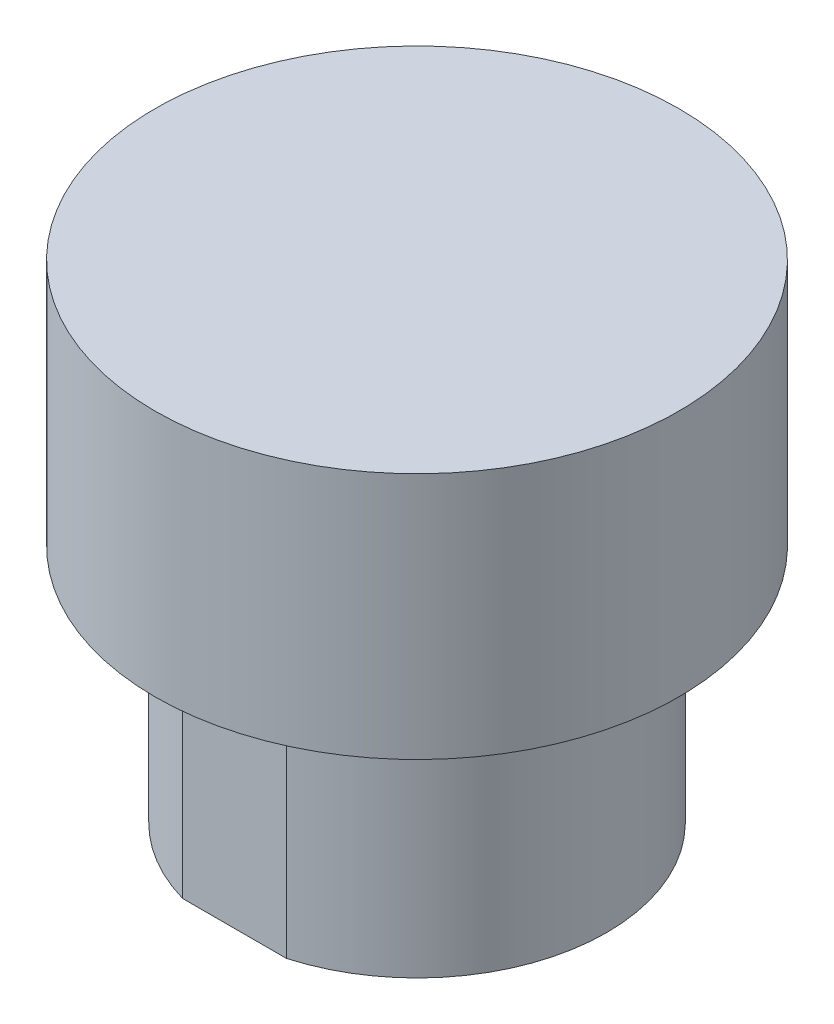
ISO-10303-21;
HEADER;
FILE_DESCRIPTION(('STEP AP214'),'2;1');
FILE_NAME('part.step','',(''),(''),'','','');
FILE_SCHEMA(('AUTOMOTIVE_DESIGN { 1 0 10303 214 1 1 1 1 }'));
ENDSEC;
DATA;
#1=APPLICATION_CONTEXT('core data for automotive mechanical design processes');
#2=APPLICATION_PROTOCOL_DEFINITION('international standard','automotive_design',2000,#1);
#3=PRODUCT_CONTEXT('',#1,'mechanical');
#4=PRODUCT('Part','Part','',(#3));
#5=PRODUCT_RELATED_PRODUCT_CATEGORY('part','',(#4));
#6=PRODUCT_DEFINITION_FORMATION('','',#4);
#7=PRODUCT_DEFINITION_CONTEXT('part definition',#1,'design');
#8=PRODUCT_DEFINITION('design','',#6,#7);
#9=PRODUCT_DEFINITION_SHAPE('','',#8);
#10=(LENGTH_UNIT() NAMED_UNIT(*) SI_UNIT(.MILLI.,.METRE.));
#11=(NAMED_UNIT(*) PLANE_ANGLE_UNIT() SI_UNIT($,.RADIAN.));
#12=(NAMED_UNIT(*) SI_UNIT($,.STERADIAN.) SOLID_ANGLE_UNIT());
#13=UNCERTAINTY_MEASURE_WITH_UNIT(LENGTH_MEASURE(1.E-05),#10,'distance_accuracy_value','');
#14=(GEOMETRIC_REPRESENTATION_CONTEXT(3) GLOBAL_UNCERTAINTY_ASSIGNED_CONTEXT((#13)) GLOBAL_UNIT_ASSIGNED_CONTEXT((#10,
#11,#12)) REPRESENTATION_CONTEXT('',''));
#15=CARTESIAN_POINT('',(0.,0.,0.));
#16=DIRECTION('',(0.,0.,1.));
#17=DIRECTION('',(1.,0.,0.));
#18=AXIS2_PLACEMENT_3D('',#15,#16,#17);
#19=CARTESIAN_POINT('',(0.,13.3,10.1));
#20=DIRECTION('',(0.,0.,1.));
#21=DIRECTION('',(1.,0.,0.));
#22=AXIS2_PLACEMENT_3D('',#19,#20,#21);
#23=PLANE('',#22);
#24=DIRECTION('',(-1.,0.,0.));
#25=VECTOR('',#24,1.);
#26=CARTESIAN_POINT('',(0.,0.,10.1));
#27=LINE('',#26,#25);
#28=CARTESIAN_POINT('',(2.87054001888147,0.,10.1));
#29=VERTEX_POINT('',#28);
#30=CARTESIAN_POINT('',(-2.87054001888147,0.,10.1));
#31=VERTEX_POINT('',#30);
#32=EDGE_CURVE('E108',#29,#31,#27,.T.);
#33=ORIENTED_EDGE('',*,*,#32,.F.);
#34=DIRECTION('',(0.,-1.,0.));
#35=VECTOR('',#34,1.);
#36=CARTESIAN_POINT('',(2.87054001888147,13.3,10.1));
#37=LINE('',#36,#35);
#38=CARTESIAN_POINT('',(2.87054001888147,13.3,10.1));
#39=VERTEX_POINT('',#38);
#40=EDGE_CURVE('E11',#39,#29,#37,.T.);
#41=ORIENTED_EDGE('',*,*,#40,.F.);
#42=DIRECTION('',(-1.,0.,0.));
#43=VECTOR('',#42,1.);
#44=CARTESIAN_POINT('',(0.,13.3,10.1));
#45=LINE('',#44,#43);
#46=CARTESIAN_POINT('',(-2.87054001888147,13.3,10.1));
#47=VERTEX_POINT('',#46);
#48=EDGE_CURVE('E86',#39,#47,#45,.T.);
#49=ORIENTED_EDGE('',*,*,#48,.T.);
#50=DIRECTION('',(0.,-1.,0.));
#51=VECTOR('',#50,1.);
#52=CARTESIAN_POINT('',(-2.87054001888147,13.3,10.1));
#53=LINE('',#52,#51);
#54=EDGE_CURVE('E81',#47,#31,#53,.T.);
#55=ORIENTED_EDGE('',*,*,#54,.T.);
#56=EDGE_LOOP('',(#33,#41,#49,#55));
#57=FACE_BOUND('',#56,.T.);
#58=ADVANCED_FACE('F43',(#57),#23,.T.);
#59=CARTESIAN_POINT('',(0.,13.3,0.));
#60=DIRECTION('',(0.,-1.,0.));
#61=DIRECTION('',(0.,0.,-1.));
#62=AXIS2_PLACEMENT_3D('',#59,#60,#61);
#63=CYLINDRICAL_SURFACE('',#62,10.5);
#64=CARTESIAN_POINT('',(0.,0.,0.));
#65=DIRECTION('',(0.,1.,0.));
#66=DIRECTION('',(0.,0.,1.));
#67=AXIS2_PLACEMENT_3D('',#64,#65,#66);
#68=CIRCLE('',#67,10.5);
#69=CARTESIAN_POINT('',(2.87054001888147,0.,-10.1));
#70=VERTEX_POINT('',#69);
#71=EDGE_CURVE('E111',#29,#70,#68,.T.);
#72=ORIENTED_EDGE('',*,*,#71,.T.);
#73=DIRECTION('',(0.,-1.,0.));
#74=VECTOR('',#73,1.);
#75=CARTESIAN_POINT('',(2.87054001888147,13.3,-10.1));
#76=LINE('',#75,#74);
#77=CARTESIAN_POINT('',(2.87054001888147,13.3,-10.1));
#78=VERTEX_POINT('',#77);
#79=EDGE_CURVE('E52',#78,#70,#76,.T.);
#80=ORIENTED_EDGE('',*,*,#79,.F.);
#81=CARTESIAN_POINT('',(0.,13.3,0.));
#82=DIRECTION('',(0.,1.,0.));
#83=DIRECTION('',(0.,0.,1.));
#84=AXIS2_PLACEMENT_3D('',#81,#82,#83);
#85=CIRCLE('',#84,10.5);
#86=EDGE_CURVE('E91',#39,#78,#85,.T.);
#87=ORIENTED_EDGE('',*,*,#86,.F.);
#88=ORIENTED_EDGE('',*,*,#40,.T.);
#89=EDGE_LOOP('',(#72,#80,#87,#88));
#90=FACE_BOUND('',#89,.T.);
#91=ADVANCED_FACE('F127',(#90),#63,.T.);
#92=CARTESIAN_POINT('',(0.,13.3,-10.1));
#93=DIRECTION('',(0.,0.,-1.));
#94=DIRECTION('',(-1.,0.,0.));
#95=AXIS2_PLACEMENT_3D('',#92,#93,#94);
#96=PLANE('',#95);
#97=DIRECTION('',(1.,0.,0.));
#98=VECTOR('',#97,1.);
#99=CARTESIAN_POINT('',(0.,0.,-10.1));
#100=LINE('',#99,#98);
#101=CARTESIAN_POINT('',(-2.87054001888147,0.,-10.1));
#102=VERTEX_POINT('',#101);
#103=EDGE_CURVE('E116',#102,#70,#100,.T.);
#104=ORIENTED_EDGE('',*,*,#103,.F.);
#105=DIRECTION('',(0.,-1.,0.));
#106=VECTOR('',#105,1.);
#107=CARTESIAN_POINT('',(-2.87054001888147,13.3,-10.1));
#108=LINE('',#107,#106);
#109=CARTESIAN_POINT('',(-2.87054001888147,13.3,-10.1));
#110=VERTEX_POINT('',#109);
#111=EDGE_CURVE('E60',#110,#102,#108,.T.);
#112=ORIENTED_EDGE('',*,*,#111,.F.);
#113=DIRECTION('',(1.,0.,0.));
#114=VECTOR('',#113,1.);
#115=CARTESIAN_POINT('',(0.,13.3,-10.1));
#116=LINE('',#115,#114);
#117=EDGE_CURVE('E101',#110,#78,#116,.T.);
#118=ORIENTED_EDGE('',*,*,#117,.T.);
#119=ORIENTED_EDGE('',*,*,#79,.T.);
#120=EDGE_LOOP('',(#104,#112,#118,#119));
#121=FACE_BOUND('',#120,.T.);
#122=ADVANCED_FACE('F124',(#121),#96,.T.);
#123=CARTESIAN_POINT('',(0.,13.3,0.));
#124=DIRECTION('',(0.,-1.,0.));
#125=DIRECTION('',(0.,0.,-1.));
#126=AXIS2_PLACEMENT_3D('',#123,#124,#125);
#127=CYLINDRICAL_SURFACE('',#126,10.5);
#128=CARTESIAN_POINT('',(0.,0.,0.));
#129=DIRECTION('',(0.,1.,0.));
#130=DIRECTION('',(0.,0.,1.));
#131=AXIS2_PLACEMENT_3D('',#128,#129,#130);
#132=CIRCLE('',#131,10.5);
#133=EDGE_CURVE('E92',#102,#31,#132,.T.);
#134=ORIENTED_EDGE('',*,*,#133,.T.);
#135=ORIENTED_EDGE('',*,*,#54,.F.);
#136=CARTESIAN_POINT('',(0.,13.3,0.));
#137=DIRECTION('',(0.,1.,0.));
#138=DIRECTION('',(0.,0.,1.));
#139=AXIS2_PLACEMENT_3D('',#136,#137,#138);
#140=CIRCLE('',#139,10.5);
#141=EDGE_CURVE('E95',#110,#47,#140,.T.);
#142=ORIENTED_EDGE('',*,*,#141,.F.);
#143=ORIENTED_EDGE('',*,*,#111,.T.);
#144=EDGE_LOOP('',(#134,#135,#142,#143));
#145=FACE_BOUND('',#144,.T.);
#146=ADVANCED_FACE('F94',(#145),#127,.T.);
#147=CARTESIAN_POINT('',(0.,0.,0.));
#148=DIRECTION('',(0.,1.,0.));
#149=DIRECTION('',(0.,0.,1.));
#150=AXIS2_PLACEMENT_3D('',#147,#148,#149);
#151=PLANE('',#150);
#152=ORIENTED_EDGE('',*,*,#32,.T.);
#153=ORIENTED_EDGE('',*,*,#133,.F.);
#154=ORIENTED_EDGE('',*,*,#103,.T.);
#155=ORIENTED_EDGE('',*,*,#71,.F.);
#156=EDGE_LOOP('',(#152,#153,#154,#155));
#157=FACE_BOUND('',#156,.T.);
#158=ADVANCED_FACE('F129',(#157),#151,.F.);
#159=CARTESIAN_POINT('',(0.,13.3,0.));
#160=DIRECTION('',(0.,1.,0.));
#161=DIRECTION('',(0.,0.,1.));
#162=AXIS2_PLACEMENT_3D('',#159,#160,#161);
#163=PLANE('',#162);
#164=CARTESIAN_POINT('',(0.,13.3,0.));
#165=DIRECTION('',(0.,1.,0.));
#166=DIRECTION('',(0.,0.,1.));
#167=AXIS2_PLACEMENT_3D('',#164,#165,#166);
#168=CIRCLE('',#167,14.5);
#169=CARTESIAN_POINT('',(0.,13.3,-14.5));
#170=VERTEX_POINT('',#169);
#171=EDGE_CURVE('E219',#170,#170,#168,.T.);
#172=ORIENTED_EDGE('',*,*,#171,.F.);
#173=EDGE_LOOP('',(#172));
#174=FACE_BOUND('',#173,.T.);
#175=ORIENTED_EDGE('',*,*,#48,.F.);
#176=ORIENTED_EDGE('',*,*,#86,.T.);
#177=ORIENTED_EDGE('',*,*,#117,.F.);
#178=ORIENTED_EDGE('',*,*,#141,.T.);
#179=EDGE_LOOP('',(#175,#176,#177,#178));
#180=FACE_BOUND('',#179,.T.);
#181=ADVANCED_FACE('F100',(#174,#180),#163,.F.);
#182=CARTESIAN_POINT('',(0.,27.,0.));
#183=DIRECTION('',(0.,-1.,0.));
#184=DIRECTION('',(0.,0.,-1.));
#185=AXIS2_PLACEMENT_3D('',#182,#183,#184);
#186=CYLINDRICAL_SURFACE('',#185,14.5);
#187=CARTESIAN_POINT('',(0.,27.,0.));
#188=DIRECTION('',(0.,1.,0.));
#189=DIRECTION('',(0.,0.,1.));
#190=AXIS2_PLACEMENT_3D('',#187,#188,#189);
#191=CIRCLE('',#190,14.5);
#192=CARTESIAN_POINT('',(0.,27.,-14.5));
#193=VERTEX_POINT('',#192);
#194=EDGE_CURVE('E112',#193,#193,#191,.T.);
#195=CARTESIAN_POINT('',(0.,27.,-14.5));
#196=CARTESIAN_POINT('',(0.,26.8572916666667,-14.5));
#197=CARTESIAN_POINT('',(0.,26.7145833333333,-14.5));
#198=CARTESIAN_POINT('',(0.,26.4291666666667,-14.5));
#199=CARTESIAN_POINT('',(0.,26.2864583333333,-14.5));
#200=CARTESIAN_POINT('',(0.,26.0010416666667,-14.5));
#201=CARTESIAN_POINT('',(0.,25.8583333333333,-14.5));
#202=CARTESIAN_POINT('',(0.,25.5729166666667,-14.5));
#203=CARTESIAN_POINT('',(0.,25.4302083333333,-14.5));
#204=CARTESIAN_POINT('',(0.,25.1447916666667,-14.5));
#205=CARTESIAN_POINT('',(0.,25.0020833333333,-14.5));
#206=CARTESIAN_POINT('',(0.,24.7166666666667,-14.5));
#207=CARTESIAN_POINT('',(0.,24.5739583333333,-14.5));
#208=CARTESIAN_POINT('',(0.,24.2885416666667,-14.5));
#209=CARTESIAN_POINT('',(0.,24.1458333333333,-14.5));
#210=CARTESIAN_POINT('',(0.,23.8604166666667,-14.5));
#211=CARTESIAN_POINT('',(0.,23.7177083333333,-14.5));
#212=CARTESIAN_POINT('',(0.,23.4322916666667,-14.5));
#213=CARTESIAN_POINT('',(0.,23.2895833333333,-14.5));
#214=CARTESIAN_POINT('',(0.,23.0041666666667,-14.5));
#215=CARTESIAN_POINT('',(0.,22.8614583333333,-14.5));
#216=CARTESIAN_POINT('',(0.,22.5760416666667,-14.5));
#217=CARTESIAN_POINT('',(0.,22.4333333333333,-14.5));
#218=CARTESIAN_POINT('',(0.,22.1479166666667,-14.5));
#219=CARTESIAN_POINT('',(0.,22.0052083333333,-14.5));
#220=CARTESIAN_POINT('',(0.,21.7197916666667,-14.5));
#221=CARTESIAN_POINT('',(0.,21.5770833333333,-14.5));
#222=CARTESIAN_POINT('',(0.,21.2916666666667,-14.5));
#223=CARTESIAN_POINT('',(0.,21.1489583333333,-14.5));
#224=CARTESIAN_POINT('',(0.,20.8635416666667,-14.5));
#225=CARTESIAN_POINT('',(0.,20.7208333333333,-14.5));
#226=CARTESIAN_POINT('',(0.,20.4354166666667,-14.5));
#227=CARTESIAN_POINT('',(0.,20.2927083333333,-14.5));
#228=CARTESIAN_POINT('',(0.,20.0072916666667,-14.5));
#229=CARTESIAN_POINT('',(0.,19.8645833333333,-14.5));
#230=CARTESIAN_POINT('',(0.,19.5791666666667,-14.5));
#231=CARTESIAN_POINT('',(0.,19.4364583333333,-14.5));
#232=CARTESIAN_POINT('',(0.,19.1510416666667,-14.5));
#233=CARTESIAN_POINT('',(0.,19.0083333333333,-14.5));
#234=CARTESIAN_POINT('',(0.,18.7229166666667,-14.5));
#235=CARTESIAN_POINT('',(0.,18.5802083333333,-14.5));
#236=CARTESIAN_POINT('',(0.,18.2947916666667,-14.5));
#237=CARTESIAN_POINT('',(0.,18.1520833333333,-14.5));
#238=CARTESIAN_POINT('',(0.,17.8666666666667,-14.5));
#239=CARTESIAN_POINT('',(0.,17.7239583333333,-14.5));
#240=CARTESIAN_POINT('',(0.,17.4385416666667,-14.5));
#241=CARTESIAN_POINT('',(0.,17.2958333333333,-14.5));
#242=CARTESIAN_POINT('',(0.,17.0104166666667,-14.5));
#243=CARTESIAN_POINT('',(0.,16.8677083333333,-14.5));
#244=CARTESIAN_POINT('',(0.,16.5822916666667,-14.5));
#245=CARTESIAN_POINT('',(0.,16.4395833333333,-14.5));
#246=CARTESIAN_POINT('',(0.,16.1541666666667,-14.5));
#247=CARTESIAN_POINT('',(0.,16.0114583333333,-14.5));
#248=CARTESIAN_POINT('',(0.,15.7260416666667,-14.5));
#249=CARTESIAN_POINT('',(0.,15.5833333333333,-14.5));
#250=CARTESIAN_POINT('',(0.,15.2979166666667,-14.5));
#251=CARTESIAN_POINT('',(0.,15.1552083333333,-14.5));
#252=CARTESIAN_POINT('',(0.,14.8697916666667,-14.5));
#253=CARTESIAN_POINT('',(0.,14.7270833333333,-14.5));
#254=CARTESIAN_POINT('',(0.,14.4416666666667,-14.5));
#255=CARTESIAN_POINT('',(0.,14.2989583333333,-14.5));
#256=CARTESIAN_POINT('',(0.,14.0135416666667,-14.5));
#257=CARTESIAN_POINT('',(0.,13.8708333333333,-14.5));
#258=CARTESIAN_POINT('',(0.,13.5854166666667,-14.5));
#259=CARTESIAN_POINT('',(0.,13.4427083333333,-14.5));
#260=CARTESIAN_POINT('',(0.,13.3,-14.5));
#261=B_SPLINE_CURVE_WITH_KNOTS('',3,(#195,#196,#197,#198,#199,#200,#201,#202,#203,#204,#205,
#206,#207,#208,#209,#210,#211,#212,#213,#214,#215,#216,#217,#218,#219,#220,#221,#222,#223,#224,
#225,#226,#227,#228,#229,#230,#231,#232,#233,#234,#235,#236,#237,#238,#239,#240,#241,#242,#243,
#244,#245,#246,#247,#248,#249,#250,#251,#252,#253,#254,#255,#256,#257,#258,#259,#260),
.UNSPECIFIED.,.F.,.F.,(4,2,2,2,2,2,2,2,2,2,2,2,2,2,2,2,2,2,2,2,2,2,2,2,2,2,2,2,2,2,2,2,4),(0.,
0.428125000000001,0.856250000000003,1.284375,1.7125,2.140625,2.56875,2.996875,3.425,3.853125,
4.28125,4.709375,5.1375,5.565625,5.99375,6.421875,6.85,7.278125,7.70625,8.134375,8.5625,
8.990625,9.41875,9.846875,10.275,10.703125,11.13125,11.559375,11.9875,12.415625,12.84375,
13.271875,13.7),.UNSPECIFIED.);
#262=EDGE_CURVE('BSEAM136',#193,#170,#261,.T.);
#263=ORIENTED_EDGE('',*,*,#194,.F.);
#264=ORIENTED_EDGE('',*,*,#171,.T.);
#265=ORIENTED_EDGE('',*,*,#262,.T.);
#266=ORIENTED_EDGE('',*,*,#262,.F.);
#267=EDGE_LOOP('',(#263,#265,#264,#266));
#268=FACE_BOUND('',#267,.T.);
#269=ADVANCED_FACE('F136',(#268),#186,.T.);
#270=CARTESIAN_POINT('',(0.,27.,0.));
#271=DIRECTION('',(0.,1.,0.));
#272=DIRECTION('',(0.,0.,1.));
#273=AXIS2_PLACEMENT_3D('',#270,#271,#272);
#274=PLANE('',#273);
#275=ORIENTED_EDGE('',*,*,#194,.T.);
#276=EDGE_LOOP('',(#275));
#277=FACE_BOUND('',#276,.T.);
#278=ADVANCED_FACE('F174',(#277),#274,.T.);
#279=CLOSED_SHELL('',(#58,#91,#122,#146,#158,#181,#269,#278));
#280=MANIFOLD_SOLID_BREP('B2',#279);
#281=ADVANCED_BREP_SHAPE_REPRESENTATION('',(#18,#280),#14);
#282=SHAPE_DEFINITION_REPRESENTATION(#9,#281);
ENDSEC;
END-ISO-10303-21;
